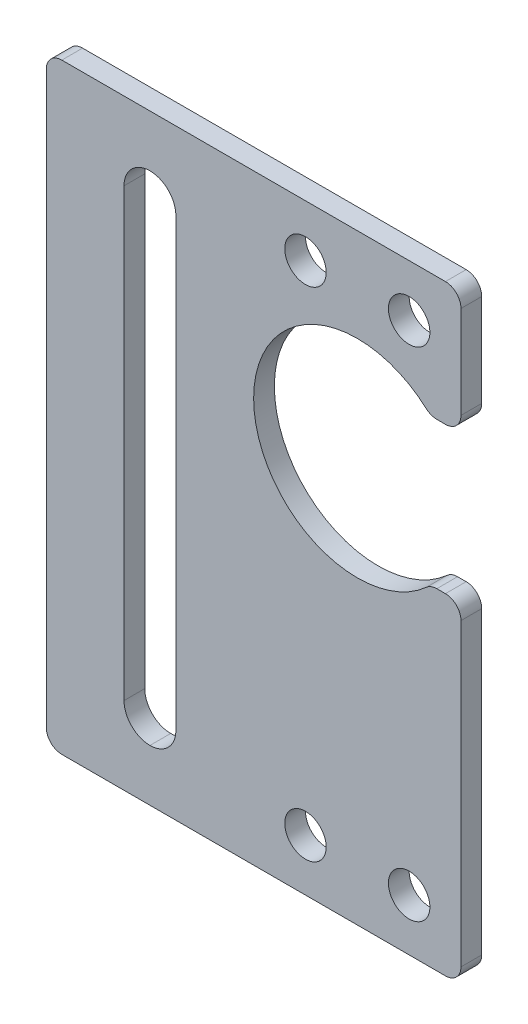
ISO-10303-21;
HEADER;
FILE_DESCRIPTION(('STEP AP214'),'2;1');
FILE_NAME('part.step','',(''),(''),'','','');
FILE_SCHEMA(('AUTOMOTIVE_DESIGN { 1 0 10303 214 1 1 1 1 }'));
ENDSEC;
DATA;
#1=APPLICATION_CONTEXT('core data for automotive mechanical design processes');
#2=APPLICATION_PROTOCOL_DEFINITION('international standard','automotive_design',2000,#1);
#3=PRODUCT_CONTEXT('',#1,'mechanical');
#4=PRODUCT('Part','Part','',(#3));
#5=PRODUCT_RELATED_PRODUCT_CATEGORY('part','',(#4));
#6=PRODUCT_DEFINITION_FORMATION('','',#4);
#7=PRODUCT_DEFINITION_CONTEXT('part definition',#1,'design');
#8=PRODUCT_DEFINITION('design','',#6,#7);
#9=PRODUCT_DEFINITION_SHAPE('','',#8);
#10=(LENGTH_UNIT() NAMED_UNIT(*) SI_UNIT(.MILLI.,.METRE.));
#11=(NAMED_UNIT(*) PLANE_ANGLE_UNIT() SI_UNIT($,.RADIAN.));
#12=(NAMED_UNIT(*) SI_UNIT($,.STERADIAN.) SOLID_ANGLE_UNIT());
#13=UNCERTAINTY_MEASURE_WITH_UNIT(LENGTH_MEASURE(1.E-05),#10,'distance_accuracy_value','');
#14=(GEOMETRIC_REPRESENTATION_CONTEXT(3) GLOBAL_UNCERTAINTY_ASSIGNED_CONTEXT((#13)) GLOBAL_UNIT_ASSIGNED_CONTEXT((#10,
#11,#12)) REPRESENTATION_CONTEXT('',''));
#15=CARTESIAN_POINT('',(0.,0.,0.));
#16=DIRECTION('',(0.,0.,1.));
#17=DIRECTION('',(1.,0.,0.));
#18=AXIS2_PLACEMENT_3D('',#15,#16,#17);
#19=CARTESIAN_POINT('',(0.,10.,2.));
#20=DIRECTION('',(0.,0.,1.));
#21=DIRECTION('',(1.,0.,0.));
#22=AXIS2_PLACEMENT_3D('',#19,#20,#21);
#23=PLANE('',#22);
#24=CARTESIAN_POINT('',(-5.,24.,2.));
#25=DIRECTION('',(0.,0.,1.));
#26=DIRECTION('',(1.,0.,0.));
#27=AXIS2_PLACEMENT_3D('',#24,#25,#26);
#28=CIRCLE('',#27,2.);
#29=CARTESIAN_POINT('',(-3.,24.,2.));
#30=VERTEX_POINT('',#29);
#31=EDGE_CURVE('E733',#30,#30,#28,.T.);
#32=ORIENTED_EDGE('',*,*,#31,.F.);
#33=EDGE_LOOP('',(#32));
#34=FACE_BOUND('',#33,.T.);
#35=CARTESIAN_POINT('',(5.,-24.,2.));
#36=DIRECTION('',(0.,0.,1.));
#37=DIRECTION('',(1.,0.,0.));
#38=AXIS2_PLACEMENT_3D('',#35,#36,#37);
#39=CIRCLE('',#38,2.);
#40=CARTESIAN_POINT('',(7.,-24.,2.));
#41=VERTEX_POINT('',#40);
#42=EDGE_CURVE('E408',#41,#41,#39,.T.);
#43=ORIENTED_EDGE('',*,*,#42,.F.);
#44=EDGE_LOOP('',(#43));
#45=FACE_BOUND('',#44,.T.);
#46=DIRECTION('',(-1.,0.,0.));
#47=VECTOR('',#46,1.);
#48=CARTESIAN_POINT('',(-15.,29.,2.));
#49=LINE('',#48,#47);
#50=CARTESIAN_POINT('',(8.5,29.,2.));
#51=VERTEX_POINT('',#50);
#52=CARTESIAN_POINT('',(-28.5,29.,2.));
#53=VERTEX_POINT('',#52);
#54=EDGE_CURVE('E421',#51,#53,#49,.T.);
#55=ORIENTED_EDGE('',*,*,#54,.T.);
#56=CARTESIAN_POINT('',(-28.5,27.5,2.));
#57=DIRECTION('',(0.,0.,1.));
#58=DIRECTION('',(1.,0.,0.));
#59=AXIS2_PLACEMENT_3D('',#56,#57,#58);
#60=CIRCLE('',#59,1.5);
#61=CARTESIAN_POINT('',(-30.,27.5,2.));
#62=VERTEX_POINT('',#61);
#63=EDGE_CURVE('E287',#53,#62,#60,.T.);
#64=ORIENTED_EDGE('',*,*,#63,.T.);
#65=DIRECTION('',(0.,-1.,0.));
#66=VECTOR('',#65,1.);
#67=CARTESIAN_POINT('',(-30.,29.,2.));
#68=LINE('',#67,#66);
#69=CARTESIAN_POINT('',(-30.,-27.5,2.));
#70=VERTEX_POINT('',#69);
#71=EDGE_CURVE('E211',#62,#70,#68,.T.);
#72=ORIENTED_EDGE('',*,*,#71,.T.);
#73=CARTESIAN_POINT('',(-28.5,-27.5,2.));
#74=DIRECTION('',(0.,0.,1.));
#75=DIRECTION('',(1.,0.,0.));
#76=AXIS2_PLACEMENT_3D('',#73,#74,#75);
#77=CIRCLE('',#76,1.5);
#78=CARTESIAN_POINT('',(-28.5,-29.,2.));
#79=VERTEX_POINT('',#78);
#80=EDGE_CURVE('E284',#70,#79,#77,.T.);
#81=ORIENTED_EDGE('',*,*,#80,.T.);
#82=DIRECTION('',(1.,0.,0.));
#83=VECTOR('',#82,1.);
#84=CARTESIAN_POINT('',(-30.,-29.,2.));
#85=LINE('',#84,#83);
#86=CARTESIAN_POINT('',(8.49999999999999,-29.,2.));
#87=VERTEX_POINT('',#86);
#88=EDGE_CURVE('E427',#79,#87,#85,.T.);
#89=ORIENTED_EDGE('',*,*,#88,.T.);
#90=CARTESIAN_POINT('',(8.50000000000001,-27.5,2.));
#91=DIRECTION('',(0.,0.,1.));
#92=DIRECTION('',(1.,0.,0.));
#93=AXIS2_PLACEMENT_3D('',#90,#91,#92);
#94=CIRCLE('',#93,1.5);
#95=CARTESIAN_POINT('',(10.,-27.5,2.));
#96=VERTEX_POINT('',#95);
#97=EDGE_CURVE('E281',#87,#96,#94,.T.);
#98=ORIENTED_EDGE('',*,*,#97,.T.);
#99=DIRECTION('',(0.,1.,0.));
#100=VECTOR('',#99,1.);
#101=CARTESIAN_POINT('',(10.,2.92893218813455,2.));
#102=LINE('',#101,#100);
#103=CARTESIAN_POINT('',(10.,1.42893218813454,2.));
#104=VERTEX_POINT('',#103);
#105=EDGE_CURVE('E431',#96,#104,#102,.T.);
#106=ORIENTED_EDGE('',*,*,#105,.T.);
#107=CARTESIAN_POINT('',(8.5,1.42893218813454,2.));
#108=DIRECTION('',(0.,0.,1.));
#109=DIRECTION('',(1.,0.,0.));
#110=AXIS2_PLACEMENT_3D('',#107,#108,#109);
#111=CIRCLE('',#110,1.5);
#112=CARTESIAN_POINT('',(8.5,2.92893218813454,2.));
#113=VERTEX_POINT('',#112);
#114=EDGE_CURVE('E272',#104,#113,#111,.T.);
#115=ORIENTED_EDGE('',*,*,#114,.T.);
#116=DIRECTION('',(-1.,0.,0.));
#117=VECTOR('',#116,1.);
#118=CARTESIAN_POINT('',(7.07106781186549,2.92893218813454,2.));
#119=LINE('',#118,#117);
#120=CARTESIAN_POINT('',(7.66725482584241,2.92893218813454,2.));
#121=VERTEX_POINT('',#120);
#122=EDGE_CURVE('E240',#113,#121,#119,.T.);
#123=ORIENTED_EDGE('',*,*,#122,.T.);
#124=CARTESIAN_POINT('',(7.66725482584241,1.42893218813454,2.));
#125=DIRECTION('',(0.,0.,1.));
#126=DIRECTION('',(1.,0.,0.));
#127=AXIS2_PLACEMENT_3D('',#124,#125,#126);
#128=CIRCLE('',#127,1.5);
#129=CARTESIAN_POINT('',(6.66717810942819,2.5468975548996,2.));
#130=VERTEX_POINT('',#129);
#131=EDGE_CURVE('E275',#121,#130,#128,.T.);
#132=ORIENTED_EDGE('',*,*,#131,.T.);
#133=CARTESIAN_POINT('',(0.,10.,2.));
#134=DIRECTION('',(0.,0.,-1.));
#135=DIRECTION('',(1.,0.,0.));
#136=AXIS2_PLACEMENT_3D('',#133,#134,#135);
#137=CIRCLE('',#136,10.);
#138=CARTESIAN_POINT('',(6.66717810942816,17.4531024451004,2.));
#139=VERTEX_POINT('',#138);
#140=EDGE_CURVE('E238',#130,#139,#137,.T.);
#141=ORIENTED_EDGE('',*,*,#140,.T.);
#142=CARTESIAN_POINT('',(7.66725482584239,18.5710678118655,2.));
#143=DIRECTION('',(0.,0.,1.));
#144=DIRECTION('',(1.,0.,0.));
#145=AXIS2_PLACEMENT_3D('',#142,#143,#144);
#146=CIRCLE('',#145,1.5);
#147=CARTESIAN_POINT('',(7.66725482584239,17.0710678118655,2.));
#148=VERTEX_POINT('',#147);
#149=EDGE_CURVE('E278',#139,#148,#146,.T.);
#150=ORIENTED_EDGE('',*,*,#149,.T.);
#151=DIRECTION('',(1.,0.,0.));
#152=VECTOR('',#151,1.);
#153=CARTESIAN_POINT('',(7.07106781186546,17.0710678118655,2.));
#154=LINE('',#153,#152);
#155=CARTESIAN_POINT('',(8.5,17.0710678118655,2.));
#156=VERTEX_POINT('',#155);
#157=EDGE_CURVE('E413',#148,#156,#154,.T.);
#158=ORIENTED_EDGE('',*,*,#157,.T.);
#159=CARTESIAN_POINT('',(8.5,18.5710678118655,2.));
#160=DIRECTION('',(0.,0.,1.));
#161=DIRECTION('',(1.,0.,0.));
#162=AXIS2_PLACEMENT_3D('',#159,#160,#161);
#163=CIRCLE('',#162,1.5);
#164=CARTESIAN_POINT('',(10.,18.5710678118655,2.));
#165=VERTEX_POINT('',#164);
#166=EDGE_CURVE('E269',#156,#165,#163,.T.);
#167=ORIENTED_EDGE('',*,*,#166,.T.);
#168=DIRECTION('',(0.,1.,0.));
#169=VECTOR('',#168,1.);
#170=CARTESIAN_POINT('',(10.,29.,2.));
#171=LINE('',#170,#169);
#172=CARTESIAN_POINT('',(10.,27.5,2.));
#173=VERTEX_POINT('',#172);
#174=EDGE_CURVE('E417',#165,#173,#171,.T.);
#175=ORIENTED_EDGE('',*,*,#174,.T.);
#176=CARTESIAN_POINT('',(8.5,27.5,2.));
#177=DIRECTION('',(0.,0.,1.));
#178=DIRECTION('',(1.,0.,0.));
#179=AXIS2_PLACEMENT_3D('',#176,#177,#178);
#180=CIRCLE('',#179,1.5);
#181=EDGE_CURVE('E266',#173,#51,#180,.T.);
#182=ORIENTED_EDGE('',*,*,#181,.T.);
#183=EDGE_LOOP('',(#55,#64,#72,#81,#89,#98,#106,#115,#123,#132,#141,#150,#158,#167,#175,#182));
#184=FACE_BOUND('',#183,.T.);
#185=CARTESIAN_POINT('',(-20.,21.5,2.));
#186=DIRECTION('',(0.,0.,1.));
#187=DIRECTION('',(1.,0.,0.));
#188=AXIS2_PLACEMENT_3D('',#185,#186,#187);
#189=CIRCLE('',#188,2.5);
#190=CARTESIAN_POINT('',(-22.5,21.5,2.));
#191=VERTEX_POINT('',#190);
#192=CARTESIAN_POINT('',(-20.,24.,2.));
#193=VERTEX_POINT('',#192);
#194=EDGE_CURVE('E56',#191,#193,#189,.F.);
#195=ORIENTED_EDGE('',*,*,#194,.T.);
#196=CARTESIAN_POINT('',(-20.,21.5,2.));
#197=DIRECTION('',(0.,0.,1.));
#198=DIRECTION('',(1.,0.,0.));
#199=AXIS2_PLACEMENT_3D('',#196,#197,#198);
#200=CIRCLE('',#199,2.5);
#201=CARTESIAN_POINT('',(-17.5,21.5,2.));
#202=VERTEX_POINT('',#201);
#203=EDGE_CURVE('E11',#193,#202,#200,.F.);
#204=ORIENTED_EDGE('',*,*,#203,.T.);
#205=DIRECTION('',(0.,1.,0.));
#206=VECTOR('',#205,1.);
#207=CARTESIAN_POINT('',(-17.5,24.,2.));
#208=LINE('',#207,#206);
#209=CARTESIAN_POINT('',(-17.5,-21.5,2.));
#210=VERTEX_POINT('',#209);
#211=EDGE_CURVE('E386',#210,#202,#208,.T.);
#212=ORIENTED_EDGE('',*,*,#211,.F.);
#213=CARTESIAN_POINT('',(-20.,-21.5,2.));
#214=DIRECTION('',(0.,0.,1.));
#215=DIRECTION('',(1.,0.,0.));
#216=AXIS2_PLACEMENT_3D('',#213,#214,#215);
#217=CIRCLE('',#216,2.5);
#218=CARTESIAN_POINT('',(-20.,-24.,2.));
#219=VERTEX_POINT('',#218);
#220=EDGE_CURVE('E349',#210,#219,#217,.F.);
#221=ORIENTED_EDGE('',*,*,#220,.T.);
#222=CARTESIAN_POINT('',(-20.,-21.5,2.));
#223=DIRECTION('',(0.,0.,1.));
#224=DIRECTION('',(1.,0.,0.));
#225=AXIS2_PLACEMENT_3D('',#222,#223,#224);
#226=CIRCLE('',#225,2.5);
#227=CARTESIAN_POINT('',(-22.5,-21.5,2.));
#228=VERTEX_POINT('',#227);
#229=EDGE_CURVE('E355',#219,#228,#226,.F.);
#230=ORIENTED_EDGE('',*,*,#229,.T.);
#231=DIRECTION('',(0.,-1.,0.));
#232=VECTOR('',#231,1.);
#233=CARTESIAN_POINT('',(-22.5,-24.,2.));
#234=LINE('',#233,#232);
#235=EDGE_CURVE('E392',#191,#228,#234,.T.);
#236=ORIENTED_EDGE('',*,*,#235,.F.);
#237=EDGE_LOOP('',(#195,#204,#212,#221,#230,#236));
#238=FACE_BOUND('',#237,.T.);
#239=CARTESIAN_POINT('',(-5.,-24.,2.));
#240=DIRECTION('',(0.,0.,1.));
#241=DIRECTION('',(1.,0.,0.));
#242=AXIS2_PLACEMENT_3D('',#239,#240,#241);
#243=CIRCLE('',#242,2.);
#244=CARTESIAN_POINT('',(-3.,-24.,2.));
#245=VERTEX_POINT('',#244);
#246=EDGE_CURVE('E742',#245,#245,#243,.T.);
#247=ORIENTED_EDGE('',*,*,#246,.F.);
#248=EDGE_LOOP('',(#247));
#249=FACE_BOUND('',#248,.T.);
#250=CARTESIAN_POINT('',(5.,24.,2.));
#251=DIRECTION('',(0.,0.,1.));
#252=DIRECTION('',(1.,0.,0.));
#253=AXIS2_PLACEMENT_3D('',#250,#251,#252);
#254=CIRCLE('',#253,2.);
#255=CARTESIAN_POINT('',(7.,24.,2.));
#256=VERTEX_POINT('',#255);
#257=EDGE_CURVE('E374',#256,#256,#254,.T.);
#258=ORIENTED_EDGE('',*,*,#257,.F.);
#259=EDGE_LOOP('',(#258));
#260=FACE_BOUND('',#259,.T.);
#261=ADVANCED_FACE('F39',(#34,#45,#184,#238,#249,#260),#23,.T.);
#262=CARTESIAN_POINT('',(0.,10.,0.));
#263=DIRECTION('',(0.,0.,1.));
#264=DIRECTION('',(1.,0.,0.));
#265=AXIS2_PLACEMENT_3D('',#262,#263,#264);
#266=PLANE('',#265);
#267=DIRECTION('',(0.,-1.,0.));
#268=VECTOR('',#267,1.);
#269=CARTESIAN_POINT('',(-30.,29.,0.));
#270=LINE('',#269,#268);
#271=CARTESIAN_POINT('',(-30.,27.5,0.));
#272=VERTEX_POINT('',#271);
#273=CARTESIAN_POINT('',(-30.,-27.5,0.));
#274=VERTEX_POINT('',#273);
#275=EDGE_CURVE('E208',#272,#274,#270,.T.);
#276=ORIENTED_EDGE('',*,*,#275,.F.);
#277=CARTESIAN_POINT('',(-28.5,27.5,0.));
#278=DIRECTION('',(0.,0.,1.));
#279=DIRECTION('',(1.,0.,0.));
#280=AXIS2_PLACEMENT_3D('',#277,#278,#279);
#281=CIRCLE('',#280,1.5);
#282=CARTESIAN_POINT('',(-28.5,29.,0.));
#283=VERTEX_POINT('',#282);
#284=EDGE_CURVE('E190',#272,#283,#281,.F.);
#285=ORIENTED_EDGE('',*,*,#284,.T.);
#286=DIRECTION('',(-1.,0.,0.));
#287=VECTOR('',#286,1.);
#288=CARTESIAN_POINT('',(-15.,29.,0.));
#289=LINE('',#288,#287);
#290=CARTESIAN_POINT('',(8.49999999999999,29.,0.));
#291=VERTEX_POINT('',#290);
#292=EDGE_CURVE('E220',#291,#283,#289,.T.);
#293=ORIENTED_EDGE('',*,*,#292,.F.);
#294=CARTESIAN_POINT('',(8.5,27.5,0.));
#295=DIRECTION('',(0.,0.,1.));
#296=DIRECTION('',(1.,0.,0.));
#297=AXIS2_PLACEMENT_3D('',#294,#295,#296);
#298=CIRCLE('',#297,1.5);
#299=CARTESIAN_POINT('',(10.,27.5,0.));
#300=VERTEX_POINT('',#299);
#301=EDGE_CURVE('E213',#291,#300,#298,.F.);
#302=ORIENTED_EDGE('',*,*,#301,.T.);
#303=DIRECTION('',(0.,1.,0.));
#304=VECTOR('',#303,1.);
#305=CARTESIAN_POINT('',(10.,29.,0.));
#306=LINE('',#305,#304);
#307=CARTESIAN_POINT('',(10.,18.5710678118655,0.));
#308=VERTEX_POINT('',#307);
#309=EDGE_CURVE('E227',#308,#300,#306,.T.);
#310=ORIENTED_EDGE('',*,*,#309,.F.);
#311=CARTESIAN_POINT('',(8.5,18.5710678118655,0.));
#312=DIRECTION('',(0.,0.,1.));
#313=DIRECTION('',(1.,0.,0.));
#314=AXIS2_PLACEMENT_3D('',#311,#312,#313);
#315=CIRCLE('',#314,1.5);
#316=CARTESIAN_POINT('',(8.5,17.0710678118655,0.));
#317=VERTEX_POINT('',#316);
#318=EDGE_CURVE('E244',#308,#317,#315,.F.);
#319=ORIENTED_EDGE('',*,*,#318,.T.);
#320=DIRECTION('',(1.,0.,0.));
#321=VECTOR('',#320,1.);
#322=CARTESIAN_POINT('',(7.07106781186546,17.0710678118655,0.));
#323=LINE('',#322,#321);
#324=CARTESIAN_POINT('',(7.66725482584239,17.0710678118655,0.));
#325=VERTEX_POINT('',#324);
#326=EDGE_CURVE('E441',#325,#317,#323,.T.);
#327=ORIENTED_EDGE('',*,*,#326,.F.);
#328=CARTESIAN_POINT('',(7.66725482584239,18.5710678118655,0.));
#329=DIRECTION('',(0.,0.,1.));
#330=DIRECTION('',(1.,0.,0.));
#331=AXIS2_PLACEMENT_3D('',#328,#329,#330);
#332=CIRCLE('',#331,1.5);
#333=CARTESIAN_POINT('',(6.66717810942816,17.4531024451004,0.));
#334=VERTEX_POINT('',#333);
#335=EDGE_CURVE('E253',#325,#334,#332,.F.);
#336=ORIENTED_EDGE('',*,*,#335,.T.);
#337=CARTESIAN_POINT('',(0.,10.,0.));
#338=DIRECTION('',(0.,0.,-1.));
#339=DIRECTION('',(1.,0.,0.));
#340=AXIS2_PLACEMENT_3D('',#337,#338,#339);
#341=CIRCLE('',#340,10.);
#342=CARTESIAN_POINT('',(6.66717810942819,2.5468975548996,0.));
#343=VERTEX_POINT('',#342);
#344=EDGE_CURVE('E398',#343,#334,#341,.T.);
#345=ORIENTED_EDGE('',*,*,#344,.F.);
#346=CARTESIAN_POINT('',(7.66725482584241,1.42893218813454,0.));
#347=DIRECTION('',(0.,0.,1.));
#348=DIRECTION('',(1.,0.,0.));
#349=AXIS2_PLACEMENT_3D('',#346,#347,#348);
#350=CIRCLE('',#349,1.5);
#351=CARTESIAN_POINT('',(7.66725482584241,2.92893218813454,0.));
#352=VERTEX_POINT('',#351);
#353=EDGE_CURVE('E250',#343,#352,#350,.F.);
#354=ORIENTED_EDGE('',*,*,#353,.T.);
#355=DIRECTION('',(-1.,0.,0.));
#356=VECTOR('',#355,1.);
#357=CARTESIAN_POINT('',(7.07106781186549,2.92893218813454,0.));
#358=LINE('',#357,#356);
#359=CARTESIAN_POINT('',(8.5,2.92893218813454,0.));
#360=VERTEX_POINT('',#359);
#361=EDGE_CURVE('E234',#360,#352,#358,.T.);
#362=ORIENTED_EDGE('',*,*,#361,.F.);
#363=CARTESIAN_POINT('',(8.5,1.42893218813454,0.));
#364=DIRECTION('',(0.,0.,1.));
#365=DIRECTION('',(1.,0.,0.));
#366=AXIS2_PLACEMENT_3D('',#363,#364,#365);
#367=CIRCLE('',#366,1.5);
#368=CARTESIAN_POINT('',(10.,1.42893218813454,0.));
#369=VERTEX_POINT('',#368);
#370=EDGE_CURVE('E247',#360,#369,#367,.F.);
#371=ORIENTED_EDGE('',*,*,#370,.T.);
#372=DIRECTION('',(0.,1.,0.));
#373=VECTOR('',#372,1.);
#374=CARTESIAN_POINT('',(10.,2.92893218813455,0.));
#375=LINE('',#374,#373);
#376=CARTESIAN_POINT('',(10.,-27.5,0.));
#377=VERTEX_POINT('',#376);
#378=EDGE_CURVE('E225',#377,#369,#375,.T.);
#379=ORIENTED_EDGE('',*,*,#378,.F.);
#380=CARTESIAN_POINT('',(8.50000000000001,-27.5,0.));
#381=DIRECTION('',(0.,0.,1.));
#382=DIRECTION('',(1.,0.,0.));
#383=AXIS2_PLACEMENT_3D('',#380,#381,#382);
#384=CIRCLE('',#383,1.5);
#385=CARTESIAN_POINT('',(8.50000000000001,-29.,0.));
#386=VERTEX_POINT('',#385);
#387=EDGE_CURVE('E256',#377,#386,#384,.F.);
#388=ORIENTED_EDGE('',*,*,#387,.T.);
#389=DIRECTION('',(1.,0.,0.));
#390=VECTOR('',#389,1.);
#391=CARTESIAN_POINT('',(-15.,-29.,0.));
#392=LINE('',#391,#390);
#393=CARTESIAN_POINT('',(-28.5,-29.,0.));
#394=VERTEX_POINT('',#393);
#395=EDGE_CURVE('E219',#394,#386,#392,.T.);
#396=ORIENTED_EDGE('',*,*,#395,.F.);
#397=CARTESIAN_POINT('',(-28.5,-27.5,0.));
#398=DIRECTION('',(0.,0.,1.));
#399=DIRECTION('',(1.,0.,0.));
#400=AXIS2_PLACEMENT_3D('',#397,#398,#399);
#401=CIRCLE('',#400,1.5);
#402=EDGE_CURVE('E202',#394,#274,#401,.F.);
#403=ORIENTED_EDGE('',*,*,#402,.T.);
#404=EDGE_LOOP('',(#276,#285,#293,#302,#310,#319,#327,#336,#345,#354,#362,#371,#379,#388,#396,#403));
#405=FACE_BOUND('',#404,.T.);
#406=DIRECTION('',(0.,-1.,0.));
#407=VECTOR('',#406,1.);
#408=CARTESIAN_POINT('',(-22.5,-24.,0.));
#409=LINE('',#408,#407);
#410=CARTESIAN_POINT('',(-22.5,21.5,0.));
#411=VERTEX_POINT('',#410);
#412=CARTESIAN_POINT('',(-22.5,-21.5,0.));
#413=VERTEX_POINT('',#412);
#414=EDGE_CURVE('E393',#411,#413,#409,.T.);
#415=ORIENTED_EDGE('',*,*,#414,.T.);
#416=CARTESIAN_POINT('',(-20.,-21.5,0.));
#417=DIRECTION('',(0.,0.,1.));
#418=DIRECTION('',(1.,0.,0.));
#419=AXIS2_PLACEMENT_3D('',#416,#417,#418);
#420=CIRCLE('',#419,2.5);
#421=CARTESIAN_POINT('',(-20.,-24.,0.));
#422=VERTEX_POINT('',#421);
#423=EDGE_CURVE('E352',#413,#422,#420,.T.);
#424=ORIENTED_EDGE('',*,*,#423,.T.);
#425=CARTESIAN_POINT('',(-20.,-21.5,0.));
#426=DIRECTION('',(0.,0.,1.));
#427=DIRECTION('',(1.,0.,0.));
#428=AXIS2_PLACEMENT_3D('',#425,#426,#427);
#429=CIRCLE('',#428,2.5);
#430=CARTESIAN_POINT('',(-17.5,-21.5,0.));
#431=VERTEX_POINT('',#430);
#432=EDGE_CURVE('E346',#422,#431,#429,.T.);
#433=ORIENTED_EDGE('',*,*,#432,.T.);
#434=DIRECTION('',(0.,1.,0.));
#435=VECTOR('',#434,1.);
#436=CARTESIAN_POINT('',(-17.5,24.,0.));
#437=LINE('',#436,#435);
#438=CARTESIAN_POINT('',(-17.5,21.5,0.));
#439=VERTEX_POINT('',#438);
#440=EDGE_CURVE('E401',#431,#439,#437,.T.);
#441=ORIENTED_EDGE('',*,*,#440,.T.);
#442=CARTESIAN_POINT('',(-20.,21.5,0.));
#443=DIRECTION('',(0.,0.,1.));
#444=DIRECTION('',(1.,0.,0.));
#445=AXIS2_PLACEMENT_3D('',#442,#443,#444);
#446=CIRCLE('',#445,2.5);
#447=CARTESIAN_POINT('',(-20.,24.,0.));
#448=VERTEX_POINT('',#447);
#449=EDGE_CURVE('E49',#439,#448,#446,.T.);
#450=ORIENTED_EDGE('',*,*,#449,.T.);
#451=CARTESIAN_POINT('',(-20.,21.5,0.));
#452=DIRECTION('',(0.,0.,1.));
#453=DIRECTION('',(1.,0.,0.));
#454=AXIS2_PLACEMENT_3D('',#451,#452,#453);
#455=CIRCLE('',#454,2.5);
#456=EDGE_CURVE('E358',#448,#411,#455,.T.);
#457=ORIENTED_EDGE('',*,*,#456,.T.);
#458=EDGE_LOOP('',(#415,#424,#433,#441,#450,#457));
#459=FACE_BOUND('',#458,.T.);
#460=CARTESIAN_POINT('',(5.,-24.,0.));
#461=DIRECTION('',(0.,0.,1.));
#462=DIRECTION('',(1.,0.,0.));
#463=AXIS2_PLACEMENT_3D('',#460,#461,#462);
#464=CIRCLE('',#463,2.);
#465=CARTESIAN_POINT('',(7.,-24.,0.));
#466=VERTEX_POINT('',#465);
#467=EDGE_CURVE('E404',#466,#466,#464,.T.);
#468=ORIENTED_EDGE('',*,*,#467,.T.);
#469=EDGE_LOOP('',(#468));
#470=FACE_BOUND('',#469,.T.);
#471=CARTESIAN_POINT('',(-5.,-24.,0.));
#472=DIRECTION('',(0.,0.,1.));
#473=DIRECTION('',(1.,0.,0.));
#474=AXIS2_PLACEMENT_3D('',#471,#472,#473);
#475=CIRCLE('',#474,2.);
#476=CARTESIAN_POINT('',(-3.,-24.,0.));
#477=VERTEX_POINT('',#476);
#478=EDGE_CURVE('E724',#477,#477,#475,.T.);
#479=ORIENTED_EDGE('',*,*,#478,.T.);
#480=EDGE_LOOP('',(#479));
#481=FACE_BOUND('',#480,.T.);
#482=CARTESIAN_POINT('',(-5.,24.,0.));
#483=DIRECTION('',(0.,0.,1.));
#484=DIRECTION('',(1.,0.,0.));
#485=AXIS2_PLACEMENT_3D('',#482,#483,#484);
#486=CIRCLE('',#485,2.);
#487=CARTESIAN_POINT('',(-3.,24.,0.));
#488=VERTEX_POINT('',#487);
#489=EDGE_CURVE('E728',#488,#488,#486,.T.);
#490=ORIENTED_EDGE('',*,*,#489,.T.);
#491=EDGE_LOOP('',(#490));
#492=FACE_BOUND('',#491,.T.);
#493=CARTESIAN_POINT('',(5.,24.,0.));
#494=DIRECTION('',(0.,0.,1.));
#495=DIRECTION('',(1.,0.,0.));
#496=AXIS2_PLACEMENT_3D('',#493,#494,#495);
#497=CIRCLE('',#496,2.);
#498=CARTESIAN_POINT('',(7.,24.,0.));
#499=VERTEX_POINT('',#498);
#500=EDGE_CURVE('E367',#499,#499,#497,.T.);
#501=ORIENTED_EDGE('',*,*,#500,.T.);
#502=EDGE_LOOP('',(#501));
#503=FACE_BOUND('',#502,.T.);
#504=ADVANCED_FACE('F216',(#405,#459,#470,#481,#492,#503),#266,.F.);
#505=CARTESIAN_POINT('',(0.,10.,2.));
#506=DIRECTION('',(0.,0.,-1.));
#507=DIRECTION('',(-1.,0.,0.));
#508=AXIS2_PLACEMENT_3D('',#505,#506,#507);
#509=CYLINDRICAL_SURFACE('',#508,10.);
#510=ORIENTED_EDGE('',*,*,#344,.T.);
#511=DIRECTION('',(0.,0.,-1.));
#512=VECTOR('',#511,1.);
#513=CARTESIAN_POINT('',(6.66717810942816,17.4531024451004,2.));
#514=LINE('',#513,#512);
#515=EDGE_CURVE('E315',#334,#139,#514,.F.);
#516=ORIENTED_EDGE('',*,*,#515,.T.);
#517=ORIENTED_EDGE('',*,*,#140,.F.);
#518=DIRECTION('',(0.,0.,-1.));
#519=VECTOR('',#518,1.);
#520=CARTESIAN_POINT('',(6.66717810942819,2.5468975548996,2.));
#521=LINE('',#520,#519);
#522=EDGE_CURVE('E311',#130,#343,#521,.T.);
#523=ORIENTED_EDGE('',*,*,#522,.T.);
#524=EDGE_LOOP('',(#510,#516,#517,#523));
#525=FACE_BOUND('',#524,.T.);
#526=ADVANCED_FACE('F476',(#525),#509,.F.);
#527=CARTESIAN_POINT('',(7.07106781186546,17.0710678118655,2.));
#528=DIRECTION('',(0.,1.,0.));
#529=DIRECTION('',(0.,0.,1.));
#530=AXIS2_PLACEMENT_3D('',#527,#528,#529);
#531=PLANE('',#530);
#532=ORIENTED_EDGE('',*,*,#157,.F.);
#533=DIRECTION('',(0.,0.,-1.));
#534=VECTOR('',#533,1.);
#535=CARTESIAN_POINT('',(7.66725482584239,17.0710678118655,2.));
#536=LINE('',#535,#534);
#537=EDGE_CURVE('E307',#148,#325,#536,.T.);
#538=ORIENTED_EDGE('',*,*,#537,.T.);
#539=ORIENTED_EDGE('',*,*,#326,.T.);
#540=DIRECTION('',(0.,0.,-1.));
#541=VECTOR('',#540,1.);
#542=CARTESIAN_POINT('',(8.5,17.0710678118655,2.));
#543=LINE('',#542,#541);
#544=EDGE_CURVE('E304',#317,#156,#543,.F.);
#545=ORIENTED_EDGE('',*,*,#544,.T.);
#546=EDGE_LOOP('',(#532,#538,#539,#545));
#547=FACE_BOUND('',#546,.T.);
#548=ADVANCED_FACE('F468',(#547),#531,.F.);
#549=CARTESIAN_POINT('',(10.,29.,2.));
#550=DIRECTION('',(-1.,0.,0.));
#551=DIRECTION('',(0.,0.,1.));
#552=AXIS2_PLACEMENT_3D('',#549,#550,#551);
#553=PLANE('',#552);
#554=ORIENTED_EDGE('',*,*,#174,.F.);
#555=DIRECTION('',(0.,0.,-1.));
#556=VECTOR('',#555,1.);
#557=CARTESIAN_POINT('',(10.,18.5710678118655,2.));
#558=LINE('',#557,#556);
#559=EDGE_CURVE('E328',#165,#308,#558,.T.);
#560=ORIENTED_EDGE('',*,*,#559,.T.);
#561=ORIENTED_EDGE('',*,*,#309,.T.);
#562=DIRECTION('',(0.,0.,-1.));
#563=VECTOR('',#562,1.);
#564=CARTESIAN_POINT('',(10.,27.5,2.));
#565=LINE('',#564,#563);
#566=EDGE_CURVE('E325',#300,#173,#565,.F.);
#567=ORIENTED_EDGE('',*,*,#566,.T.);
#568=EDGE_LOOP('',(#554,#560,#561,#567));
#569=FACE_BOUND('',#568,.T.);
#570=ADVANCED_FACE('F450',(#569),#553,.F.);
#571=CARTESIAN_POINT('',(-15.,29.,2.));
#572=DIRECTION('',(0.,-1.,0.));
#573=DIRECTION('',(1.,0.,0.));
#574=AXIS2_PLACEMENT_3D('',#571,#572,#573);
#575=PLANE('',#574);
#576=ORIENTED_EDGE('',*,*,#292,.T.);
#577=DIRECTION('',(0.,0.,-1.));
#578=VECTOR('',#577,1.);
#579=CARTESIAN_POINT('',(-28.5,29.,2.));
#580=LINE('',#579,#578);
#581=EDGE_CURVE('E195',#283,#53,#580,.F.);
#582=ORIENTED_EDGE('',*,*,#581,.T.);
#583=ORIENTED_EDGE('',*,*,#54,.F.);
#584=DIRECTION('',(0.,0.,-1.));
#585=VECTOR('',#584,1.);
#586=CARTESIAN_POINT('',(8.5,29.,2.));
#587=LINE('',#586,#585);
#588=EDGE_CURVE('E201',#51,#291,#587,.T.);
#589=ORIENTED_EDGE('',*,*,#588,.T.);
#590=EDGE_LOOP('',(#576,#582,#583,#589));
#591=FACE_BOUND('',#590,.T.);
#592=ADVANCED_FACE('F459',(#591),#575,.F.);
#593=CARTESIAN_POINT('',(-30.,29.,2.));
#594=DIRECTION('',(1.,0.,0.));
#595=DIRECTION('',(0.,0.,-1.));
#596=AXIS2_PLACEMENT_3D('',#593,#594,#595);
#597=PLANE('',#596);
#598=ORIENTED_EDGE('',*,*,#71,.F.);
#599=DIRECTION('',(0.,0.,-1.));
#600=VECTOR('',#599,1.);
#601=CARTESIAN_POINT('',(-30.,27.5,2.));
#602=LINE('',#601,#600);
#603=EDGE_CURVE('E194',#62,#272,#602,.T.);
#604=ORIENTED_EDGE('',*,*,#603,.T.);
#605=ORIENTED_EDGE('',*,*,#275,.T.);
#606=DIRECTION('',(0.,0.,-1.));
#607=VECTOR('',#606,1.);
#608=CARTESIAN_POINT('',(-30.,-27.5,2.));
#609=LINE('',#608,#607);
#610=EDGE_CURVE('E214',#274,#70,#609,.F.);
#611=ORIENTED_EDGE('',*,*,#610,.T.);
#612=EDGE_LOOP('',(#598,#604,#605,#611));
#613=FACE_BOUND('',#612,.T.);
#614=ADVANCED_FACE('F207',(#613),#597,.F.);
#615=CARTESIAN_POINT('',(-15.,-29.,2.));
#616=DIRECTION('',(0.,1.,0.));
#617=DIRECTION('',(0.,0.,1.));
#618=AXIS2_PLACEMENT_3D('',#615,#616,#617);
#619=PLANE('',#618);
#620=ORIENTED_EDGE('',*,*,#88,.F.);
#621=DIRECTION('',(0.,0.,-1.));
#622=VECTOR('',#621,1.);
#623=CARTESIAN_POINT('',(-28.5,-29.,2.));
#624=LINE('',#623,#622);
#625=EDGE_CURVE('E293',#79,#394,#624,.T.);
#626=ORIENTED_EDGE('',*,*,#625,.T.);
#627=ORIENTED_EDGE('',*,*,#395,.T.);
#628=DIRECTION('',(0.,0.,-1.));
#629=VECTOR('',#628,1.);
#630=CARTESIAN_POINT('',(8.50000000000001,-29.,2.));
#631=LINE('',#630,#629);
#632=EDGE_CURVE('E290',#386,#87,#631,.F.);
#633=ORIENTED_EDGE('',*,*,#632,.T.);
#634=EDGE_LOOP('',(#620,#626,#627,#633));
#635=FACE_BOUND('',#634,.T.);
#636=ADVANCED_FACE('F466',(#635),#619,.F.);
#637=CARTESIAN_POINT('',(10.,2.92893218813455,2.));
#638=DIRECTION('',(-1.,0.,0.));
#639=DIRECTION('',(0.,-1.,0.));
#640=AXIS2_PLACEMENT_3D('',#637,#638,#639);
#641=PLANE('',#640);
#642=ORIENTED_EDGE('',*,*,#105,.F.);
#643=DIRECTION('',(0.,0.,-1.));
#644=VECTOR('',#643,1.);
#645=CARTESIAN_POINT('',(10.,-27.5,2.));
#646=LINE('',#645,#644);
#647=EDGE_CURVE('E300',#96,#377,#646,.T.);
#648=ORIENTED_EDGE('',*,*,#647,.T.);
#649=ORIENTED_EDGE('',*,*,#378,.T.);
#650=DIRECTION('',(0.,0.,-1.));
#651=VECTOR('',#650,1.);
#652=CARTESIAN_POINT('',(10.,1.42893218813454,2.));
#653=LINE('',#652,#651);
#654=EDGE_CURVE('E297',#369,#104,#653,.F.);
#655=ORIENTED_EDGE('',*,*,#654,.T.);
#656=EDGE_LOOP('',(#642,#648,#649,#655));
#657=FACE_BOUND('',#656,.T.);
#658=ADVANCED_FACE('F486',(#657),#641,.F.);
#659=CARTESIAN_POINT('',(7.07106781186549,2.92893218813454,2.));
#660=DIRECTION('',(0.,-1.,0.));
#661=DIRECTION('',(1.,0.,0.));
#662=AXIS2_PLACEMENT_3D('',#659,#660,#661);
#663=PLANE('',#662);
#664=ORIENTED_EDGE('',*,*,#361,.T.);
#665=DIRECTION('',(0.,0.,-1.));
#666=VECTOR('',#665,1.);
#667=CARTESIAN_POINT('',(7.66725482584241,2.92893218813454,2.));
#668=LINE('',#667,#666);
#669=EDGE_CURVE('E322',#352,#121,#668,.F.);
#670=ORIENTED_EDGE('',*,*,#669,.T.);
#671=ORIENTED_EDGE('',*,*,#122,.F.);
#672=DIRECTION('',(0.,0.,-1.));
#673=VECTOR('',#672,1.);
#674=CARTESIAN_POINT('',(8.5,2.92893218813454,2.));
#675=LINE('',#674,#673);
#676=EDGE_CURVE('E318',#113,#360,#675,.T.);
#677=ORIENTED_EDGE('',*,*,#676,.T.);
#678=EDGE_LOOP('',(#664,#670,#671,#677));
#679=FACE_BOUND('',#678,.T.);
#680=ADVANCED_FACE('F483',(#679),#663,.F.);
#681=CARTESIAN_POINT('',(-17.5,24.,2.));
#682=DIRECTION('',(-1.,0.,0.));
#683=DIRECTION('',(0.,-1.,0.));
#684=AXIS2_PLACEMENT_3D('',#681,#682,#683);
#685=PLANE('',#684);
#686=ORIENTED_EDGE('',*,*,#440,.F.);
#687=DIRECTION('',(0.,0.,-1.));
#688=VECTOR('',#687,1.);
#689=CARTESIAN_POINT('',(-17.5,-21.5,2.));
#690=LINE('',#689,#688);
#691=EDGE_CURVE('E335',#431,#210,#690,.F.);
#692=ORIENTED_EDGE('',*,*,#691,.T.);
#693=ORIENTED_EDGE('',*,*,#211,.T.);
#694=DIRECTION('',(0.,0.,-1.));
#695=VECTOR('',#694,1.);
#696=CARTESIAN_POINT('',(-17.5,21.5,0.));
#697=LINE('',#696,#695);
#698=EDGE_CURVE('E332',#202,#439,#697,.T.);
#699=ORIENTED_EDGE('',*,*,#698,.T.);
#700=EDGE_LOOP('',(#686,#692,#693,#699));
#701=FACE_BOUND('',#700,.T.);
#702=ADVANCED_FACE('F389',(#701),#685,.T.);
#703=CARTESIAN_POINT('',(-22.5,-24.,2.));
#704=DIRECTION('',(1.,0.,0.));
#705=DIRECTION('',(0.,0.,-1.));
#706=AXIS2_PLACEMENT_3D('',#703,#704,#705);
#707=PLANE('',#706);
#708=ORIENTED_EDGE('',*,*,#235,.T.);
#709=DIRECTION('',(0.,0.,-1.));
#710=VECTOR('',#709,1.);
#711=CARTESIAN_POINT('',(-22.5,-21.5,0.));
#712=LINE('',#711,#710);
#713=EDGE_CURVE('E343',#228,#413,#712,.T.);
#714=ORIENTED_EDGE('',*,*,#713,.T.);
#715=ORIENTED_EDGE('',*,*,#414,.F.);
#716=DIRECTION('',(0.,0.,-1.));
#717=VECTOR('',#716,1.);
#718=CARTESIAN_POINT('',(-22.5,21.5,2.));
#719=LINE('',#718,#717);
#720=EDGE_CURVE('E339',#411,#191,#719,.F.);
#721=ORIENTED_EDGE('',*,*,#720,.T.);
#722=EDGE_LOOP('',(#708,#714,#715,#721));
#723=FACE_BOUND('',#722,.T.);
#724=ADVANCED_FACE('F680',(#723),#707,.T.);
#725=CARTESIAN_POINT('',(5.,-24.,2.));
#726=DIRECTION('',(0.,0.,-1.));
#727=DIRECTION('',(-1.,0.,0.));
#728=AXIS2_PLACEMENT_3D('',#725,#726,#727);
#729=CYLINDRICAL_SURFACE('',#728,2.);
#730=ORIENTED_EDGE('',*,*,#42,.T.);
#731=EDGE_LOOP('',(#730));
#732=FACE_BOUND('',#731,.T.);
#733=ORIENTED_EDGE('',*,*,#467,.F.);
#734=EDGE_LOOP('',(#733));
#735=FACE_BOUND('',#734,.T.);
#736=ADVANCED_FACE('F671',(#732,#735),#729,.F.);
#737=CARTESIAN_POINT('',(-5.,-24.,2.));
#738=DIRECTION('',(0.,0.,-1.));
#739=DIRECTION('',(-1.,0.,0.));
#740=AXIS2_PLACEMENT_3D('',#737,#738,#739);
#741=CYLINDRICAL_SURFACE('',#740,2.);
#742=ORIENTED_EDGE('',*,*,#246,.T.);
#743=EDGE_LOOP('',(#742));
#744=FACE_BOUND('',#743,.T.);
#745=ORIENTED_EDGE('',*,*,#478,.F.);
#746=EDGE_LOOP('',(#745));
#747=FACE_BOUND('',#746,.T.);
#748=ADVANCED_FACE('F661',(#744,#747),#741,.F.);
#749=CARTESIAN_POINT('',(-5.,24.,2.));
#750=DIRECTION('',(0.,0.,-1.));
#751=DIRECTION('',(-1.,0.,0.));
#752=AXIS2_PLACEMENT_3D('',#749,#750,#751);
#753=CYLINDRICAL_SURFACE('',#752,2.);
#754=ORIENTED_EDGE('',*,*,#31,.T.);
#755=EDGE_LOOP('',(#754));
#756=FACE_BOUND('',#755,.T.);
#757=ORIENTED_EDGE('',*,*,#489,.F.);
#758=EDGE_LOOP('',(#757));
#759=FACE_BOUND('',#758,.T.);
#760=ADVANCED_FACE('F651',(#756,#759),#753,.F.);
#761=CARTESIAN_POINT('',(5.,24.,2.));
#762=DIRECTION('',(0.,0.,-1.));
#763=DIRECTION('',(-1.,0.,0.));
#764=AXIS2_PLACEMENT_3D('',#761,#762,#763);
#765=CYLINDRICAL_SURFACE('',#764,2.);
#766=ORIENTED_EDGE('',*,*,#257,.T.);
#767=EDGE_LOOP('',(#766));
#768=FACE_BOUND('',#767,.T.);
#769=ORIENTED_EDGE('',*,*,#500,.F.);
#770=EDGE_LOOP('',(#769));
#771=FACE_BOUND('',#770,.T.);
#772=ADVANCED_FACE('F512',(#768,#771),#765,.F.);
#773=CARTESIAN_POINT('',(-28.5,27.5,2.));
#774=DIRECTION('',(0.,0.,-1.));
#775=DIRECTION('',(-1.,0.,0.));
#776=AXIS2_PLACEMENT_3D('',#773,#774,#775);
#777=CYLINDRICAL_SURFACE('',#776,1.5);
#778=ORIENTED_EDGE('',*,*,#63,.F.);
#779=ORIENTED_EDGE('',*,*,#581,.F.);
#780=ORIENTED_EDGE('',*,*,#284,.F.);
#781=ORIENTED_EDGE('',*,*,#603,.F.);
#782=EDGE_LOOP('',(#778,#779,#780,#781));
#783=FACE_BOUND('',#782,.T.);
#784=ADVANCED_FACE('F193',(#783),#777,.T.);
#785=CARTESIAN_POINT('',(-28.5,-27.5,2.));
#786=DIRECTION('',(0.,0.,-1.));
#787=DIRECTION('',(-1.,0.,0.));
#788=AXIS2_PLACEMENT_3D('',#785,#786,#787);
#789=CYLINDRICAL_SURFACE('',#788,1.5);
#790=ORIENTED_EDGE('',*,*,#80,.F.);
#791=ORIENTED_EDGE('',*,*,#610,.F.);
#792=ORIENTED_EDGE('',*,*,#402,.F.);
#793=ORIENTED_EDGE('',*,*,#625,.F.);
#794=EDGE_LOOP('',(#790,#791,#792,#793));
#795=FACE_BOUND('',#794,.T.);
#796=ADVANCED_FACE('F501',(#795),#789,.T.);
#797=CARTESIAN_POINT('',(8.50000000000001,-27.5,2.));
#798=DIRECTION('',(0.,0.,-1.));
#799=DIRECTION('',(-1.,0.,0.));
#800=AXIS2_PLACEMENT_3D('',#797,#798,#799);
#801=CYLINDRICAL_SURFACE('',#800,1.5);
#802=ORIENTED_EDGE('',*,*,#97,.F.);
#803=ORIENTED_EDGE('',*,*,#632,.F.);
#804=ORIENTED_EDGE('',*,*,#387,.F.);
#805=ORIENTED_EDGE('',*,*,#647,.F.);
#806=EDGE_LOOP('',(#802,#803,#804,#805));
#807=FACE_BOUND('',#806,.T.);
#808=ADVANCED_FACE('F503',(#807),#801,.T.);
#809=CARTESIAN_POINT('',(7.66725482584239,18.5710678118655,2.));
#810=DIRECTION('',(0.,0.,-1.));
#811=DIRECTION('',(-1.,0.,0.));
#812=AXIS2_PLACEMENT_3D('',#809,#810,#811);
#813=CYLINDRICAL_SURFACE('',#812,1.5);
#814=ORIENTED_EDGE('',*,*,#149,.F.);
#815=ORIENTED_EDGE('',*,*,#515,.F.);
#816=ORIENTED_EDGE('',*,*,#335,.F.);
#817=ORIENTED_EDGE('',*,*,#537,.F.);
#818=EDGE_LOOP('',(#814,#815,#816,#817));
#819=FACE_BOUND('',#818,.T.);
#820=ADVANCED_FACE('F509',(#819),#813,.T.);
#821=CARTESIAN_POINT('',(7.66725482584241,1.42893218813454,2.));
#822=DIRECTION('',(0.,0.,-1.));
#823=DIRECTION('',(-1.,0.,0.));
#824=AXIS2_PLACEMENT_3D('',#821,#822,#823);
#825=CYLINDRICAL_SURFACE('',#824,1.5);
#826=ORIENTED_EDGE('',*,*,#131,.F.);
#827=ORIENTED_EDGE('',*,*,#669,.F.);
#828=ORIENTED_EDGE('',*,*,#353,.F.);
#829=ORIENTED_EDGE('',*,*,#522,.F.);
#830=EDGE_LOOP('',(#826,#827,#828,#829));
#831=FACE_BOUND('',#830,.T.);
#832=ADVANCED_FACE('F518',(#831),#825,.T.);
#833=CARTESIAN_POINT('',(8.5,1.42893218813454,2.));
#834=DIRECTION('',(0.,0.,-1.));
#835=DIRECTION('',(-1.,0.,0.));
#836=AXIS2_PLACEMENT_3D('',#833,#834,#835);
#837=CYLINDRICAL_SURFACE('',#836,1.5);
#838=ORIENTED_EDGE('',*,*,#114,.F.);
#839=ORIENTED_EDGE('',*,*,#654,.F.);
#840=ORIENTED_EDGE('',*,*,#370,.F.);
#841=ORIENTED_EDGE('',*,*,#676,.F.);
#842=EDGE_LOOP('',(#838,#839,#840,#841));
#843=FACE_BOUND('',#842,.T.);
#844=ADVANCED_FACE('F522',(#843),#837,.T.);
#845=CARTESIAN_POINT('',(8.5,18.5710678118655,2.));
#846=DIRECTION('',(0.,0.,-1.));
#847=DIRECTION('',(-1.,0.,0.));
#848=AXIS2_PLACEMENT_3D('',#845,#846,#847);
#849=CYLINDRICAL_SURFACE('',#848,1.5);
#850=ORIENTED_EDGE('',*,*,#166,.F.);
#851=ORIENTED_EDGE('',*,*,#544,.F.);
#852=ORIENTED_EDGE('',*,*,#318,.F.);
#853=ORIENTED_EDGE('',*,*,#559,.F.);
#854=EDGE_LOOP('',(#850,#851,#852,#853));
#855=FACE_BOUND('',#854,.T.);
#856=ADVANCED_FACE('F526',(#855),#849,.T.);
#857=CARTESIAN_POINT('',(8.5,27.5,2.));
#858=DIRECTION('',(0.,0.,-1.));
#859=DIRECTION('',(-1.,0.,0.));
#860=AXIS2_PLACEMENT_3D('',#857,#858,#859);
#861=CYLINDRICAL_SURFACE('',#860,1.5);
#862=ORIENTED_EDGE('',*,*,#181,.F.);
#863=ORIENTED_EDGE('',*,*,#566,.F.);
#864=ORIENTED_EDGE('',*,*,#301,.F.);
#865=ORIENTED_EDGE('',*,*,#588,.F.);
#866=EDGE_LOOP('',(#862,#863,#864,#865));
#867=FACE_BOUND('',#866,.T.);
#868=ADVANCED_FACE('F454',(#867),#861,.T.);
#869=CARTESIAN_POINT('',(-20.,-21.5,2.));
#870=DIRECTION('',(0.,0.,1.));
#871=DIRECTION('',(1.,0.,0.));
#872=AXIS2_PLACEMENT_3D('',#869,#870,#871);
#873=CYLINDRICAL_SURFACE('',#872,2.5);
#874=ORIENTED_EDGE('',*,*,#713,.F.);
#875=ORIENTED_EDGE('',*,*,#229,.F.);
#876=DIRECTION('',(0.,0.,-1.));
#877=VECTOR('',#876,1.);
#878=CARTESIAN_POINT('',(-20.,-24.,2.));
#879=LINE('',#878,#877);
#880=EDGE_CURVE('E364',#422,#219,#879,.F.);
#881=ORIENTED_EDGE('',*,*,#880,.F.);
#882=ORIENTED_EDGE('',*,*,#423,.F.);
#883=EDGE_LOOP('',(#874,#875,#881,#882));
#884=FACE_BOUND('',#883,.T.);
#885=ADVANCED_FACE('F533',(#884),#873,.F.);
#886=CARTESIAN_POINT('',(-20.,-21.5,2.));
#887=DIRECTION('',(0.,0.,1.));
#888=DIRECTION('',(1.,0.,0.));
#889=AXIS2_PLACEMENT_3D('',#886,#887,#888);
#890=CYLINDRICAL_SURFACE('',#889,2.5);
#891=ORIENTED_EDGE('',*,*,#220,.F.);
#892=ORIENTED_EDGE('',*,*,#691,.F.);
#893=ORIENTED_EDGE('',*,*,#432,.F.);
#894=ORIENTED_EDGE('',*,*,#880,.T.);
#895=EDGE_LOOP('',(#891,#892,#893,#894));
#896=FACE_BOUND('',#895,.T.);
#897=ADVANCED_FACE('F534',(#896),#890,.F.);
#898=CARTESIAN_POINT('',(-20.,21.5,2.));
#899=DIRECTION('',(0.,0.,1.));
#900=DIRECTION('',(1.,0.,0.));
#901=AXIS2_PLACEMENT_3D('',#898,#899,#900);
#902=CYLINDRICAL_SURFACE('',#901,2.5);
#903=ORIENTED_EDGE('',*,*,#698,.F.);
#904=ORIENTED_EDGE('',*,*,#203,.F.);
#905=DIRECTION('',(0.,0.,-1.));
#906=VECTOR('',#905,1.);
#907=CARTESIAN_POINT('',(-20.,24.,2.));
#908=LINE('',#907,#906);
#909=EDGE_CURVE('E43',#448,#193,#908,.F.);
#910=ORIENTED_EDGE('',*,*,#909,.F.);
#911=ORIENTED_EDGE('',*,*,#449,.F.);
#912=EDGE_LOOP('',(#903,#904,#910,#911));
#913=FACE_BOUND('',#912,.T.);
#914=ADVANCED_FACE('F41',(#913),#902,.F.);
#915=CARTESIAN_POINT('',(-20.,21.5,2.));
#916=DIRECTION('',(0.,0.,1.));
#917=DIRECTION('',(1.,0.,0.));
#918=AXIS2_PLACEMENT_3D('',#915,#916,#917);
#919=CYLINDRICAL_SURFACE('',#918,2.5);
#920=ORIENTED_EDGE('',*,*,#194,.F.);
#921=ORIENTED_EDGE('',*,*,#720,.F.);
#922=ORIENTED_EDGE('',*,*,#456,.F.);
#923=ORIENTED_EDGE('',*,*,#909,.T.);
#924=EDGE_LOOP('',(#920,#921,#922,#923));
#925=FACE_BOUND('',#924,.T.);
#926=ADVANCED_FACE('F379',(#925),#919,.F.);
#927=CLOSED_SHELL('',(#261,#504,#526,#548,#570,#592,#614,#636,#658,#680,#702,#724,#736,#748,
#760,#772,#784,#796,#808,#820,#832,#844,#856,#868,#885,#897,#914,#926));
#928=MANIFOLD_SOLID_BREP('B2',#927);
#929=ADVANCED_BREP_SHAPE_REPRESENTATION('',(#18,#928),#14);
#930=SHAPE_DEFINITION_REPRESENTATION(#9,#929);
ENDSEC;
END-ISO-10303-21;
